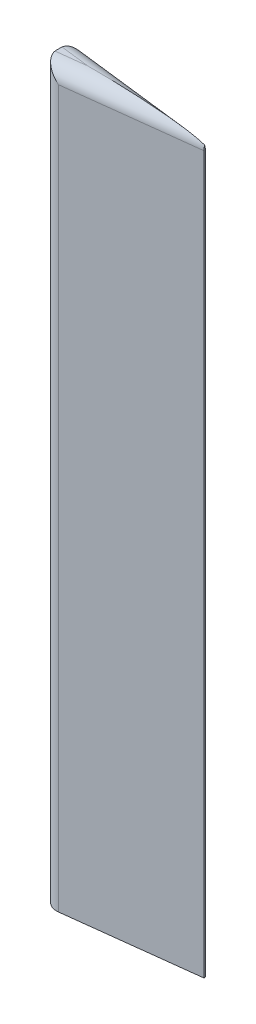
ISO-10303-21;
HEADER;
FILE_DESCRIPTION(('STEP AP214'),'2;1');
FILE_NAME('part.step','',(''),(''),'','','');
FILE_SCHEMA(('AUTOMOTIVE_DESIGN { 1 0 10303 214 1 1 1 1 }'));
ENDSEC;
DATA;
#1=APPLICATION_CONTEXT('core data for automotive mechanical design processes');
#2=APPLICATION_PROTOCOL_DEFINITION('international standard','automotive_design',2000,#1);
#3=PRODUCT_CONTEXT('',#1,'mechanical');
#4=PRODUCT('Part','Part','',(#3));
#5=PRODUCT_RELATED_PRODUCT_CATEGORY('part','',(#4));
#6=PRODUCT_DEFINITION_FORMATION('','',#4);
#7=PRODUCT_DEFINITION_CONTEXT('part definition',#1,'design');
#8=PRODUCT_DEFINITION('design','',#6,#7);
#9=PRODUCT_DEFINITION_SHAPE('','',#8);
#10=(LENGTH_UNIT() NAMED_UNIT(*) SI_UNIT(.MILLI.,.METRE.));
#11=(NAMED_UNIT(*) PLANE_ANGLE_UNIT() SI_UNIT($,.RADIAN.));
#12=(NAMED_UNIT(*) SI_UNIT($,.STERADIAN.) SOLID_ANGLE_UNIT());
#13=UNCERTAINTY_MEASURE_WITH_UNIT(LENGTH_MEASURE(1.E-05),#10,'distance_accuracy_value','');
#14=(GEOMETRIC_REPRESENTATION_CONTEXT(3) GLOBAL_UNCERTAINTY_ASSIGNED_CONTEXT((#13)) GLOBAL_UNIT_ASSIGNED_CONTEXT((#10,
#11,#12)) REPRESENTATION_CONTEXT('',''));
#15=CARTESIAN_POINT('',(0.,0.,0.));
#16=DIRECTION('',(0.,0.,1.));
#17=DIRECTION('',(1.,0.,0.));
#18=AXIS2_PLACEMENT_3D('',#15,#16,#17);
#19=CARTESIAN_POINT('',(20.,0.,5.));
#20=DIRECTION('',(0.,1.,0.));
#21=DIRECTION('',(-1.,0.,0.));
#22=AXIS2_PLACEMENT_3D('',#19,#20,#21);
#23=PLANE('',#22);
#24=DIRECTION('',(0.,0.,-1.));
#25=VECTOR('',#24,1.);
#26=CARTESIAN_POINT('',(0.,0.,5.));
#27=LINE('',#26,#25);
#28=CARTESIAN_POINT('',(0.,0.,2.74565147007773));
#29=VERTEX_POINT('',#28);
#30=CARTESIAN_POINT('',(0.,0.,2.25434852992227));
#31=VERTEX_POINT('',#30);
#32=EDGE_CURVE('E143',#29,#31,#27,.T.);
#33=ORIENTED_EDGE('',*,*,#32,.T.);
#34=CARTESIAN_POINT('',(2.,0.,2.25434852992227));
#35=DIRECTION('',(0.,1.,0.));
#36=DIRECTION('',(-1.,0.,0.));
#37=AXIS2_PLACEMENT_3D('',#34,#35,#36);
#38=CIRCLE('',#37,2.);
#39=CARTESIAN_POINT('',(2.23829044123685,0.,0.268594852948421));
#40=VERTEX_POINT('',#39);
#41=EDGE_CURVE('E119',#31,#40,#38,.F.);
#42=ORIENTED_EDGE('',*,*,#41,.T.);
#43=DIRECTION('',(0.992876838486922,0.,0.119145220618431));
#44=VECTOR('',#43,1.);
#45=CARTESIAN_POINT('',(20.307570977918,0.,2.43690851735016));
#46=LINE('',#45,#44);
#47=CARTESIAN_POINT('',(20.,0.,2.4));
#48=VERTEX_POINT('',#47);
#49=EDGE_CURVE('E113',#40,#48,#46,.T.);
#50=ORIENTED_EDGE('',*,*,#49,.T.);
#51=DIRECTION('',(0.,0.,-1.));
#52=VECTOR('',#51,1.);
#53=CARTESIAN_POINT('',(20.,0.,5.));
#54=LINE('',#53,#52);
#55=CARTESIAN_POINT('',(20.,0.,2.6));
#56=VERTEX_POINT('',#55);
#57=EDGE_CURVE('E118',#56,#48,#54,.T.);
#58=ORIENTED_EDGE('',*,*,#57,.F.);
#59=DIRECTION('',(-0.992876838486922,0.,0.119145220618431));
#60=VECTOR('',#59,1.);
#61=CARTESIAN_POINT('',(19.7160883280757,0.,2.63406940063091));
#62=LINE('',#61,#60);
#63=CARTESIAN_POINT('',(2.23829044123685,0.,4.73140514705158));
#64=VERTEX_POINT('',#63);
#65=EDGE_CURVE('E123',#56,#64,#62,.T.);
#66=ORIENTED_EDGE('',*,*,#65,.T.);
#67=CARTESIAN_POINT('',(2.,0.,2.74565147007773));
#68=DIRECTION('',(0.,1.,0.));
#69=DIRECTION('',(-1.,0.,0.));
#70=AXIS2_PLACEMENT_3D('',#67,#68,#69);
#71=CIRCLE('',#70,2.);
#72=EDGE_CURVE('E153',#64,#29,#71,.F.);
#73=ORIENTED_EDGE('',*,*,#72,.T.);
#74=EDGE_LOOP('',(#33,#42,#50,#58,#66,#73));
#75=FACE_BOUND('',#74,.T.);
#76=ADVANCED_FACE('F45',(#75),#23,.F.);
#77=CARTESIAN_POINT('',(20.,100.,5.));
#78=DIRECTION('',(-1.,0.,0.));
#79=DIRECTION('',(0.,0.,1.));
#80=AXIS2_PLACEMENT_3D('',#77,#78,#79);
#81=PLANE('',#80);
#82=DIRECTION('',(0.,1.,0.));
#83=VECTOR('',#82,1.);
#84=CARTESIAN_POINT('',(20.,-1.2E-05,2.4));
#85=LINE('',#84,#83);
#86=CARTESIAN_POINT('',(20.,98.,2.4));
#87=VERTEX_POINT('',#86);
#88=EDGE_CURVE('E124',#48,#87,#85,.T.);
#89=ORIENTED_EDGE('',*,*,#88,.T.);
#90=CARTESIAN_POINT('',(20.,98.,4.41434852992227));
#91=DIRECTION('',(-1.,0.,0.));
#92=DIRECTION('',(0.,0.,1.));
#93=AXIS2_PLACEMENT_3D('',#90,#91,#92);
#94=ELLIPSE('',#93,2.01434852992227,2.);
#95=CARTESIAN_POINT('',(20.,98.6223284432121,2.5));
#96=VERTEX_POINT('',#95);
#97=EDGE_CURVE('E11',#87,#96,#94,.F.);
#98=ORIENTED_EDGE('',*,*,#97,.T.);
#99=CARTESIAN_POINT('',(20.,98.,0.58565147007773));
#100=DIRECTION('',(-1.,0.,0.));
#101=DIRECTION('',(0.,0.,1.));
#102=AXIS2_PLACEMENT_3D('',#99,#100,#101);
#103=ELLIPSE('',#102,2.01434852992227,2.);
#104=CARTESIAN_POINT('',(20.,98.,2.6));
#105=VERTEX_POINT('',#104);
#106=EDGE_CURVE('E55',#96,#105,#103,.F.);
#107=ORIENTED_EDGE('',*,*,#106,.T.);
#108=DIRECTION('',(0.,1.,0.));
#109=VECTOR('',#108,1.);
#110=CARTESIAN_POINT('',(20.,-1.2E-05,2.6));
#111=LINE('',#110,#109);
#112=EDGE_CURVE('E130',#56,#105,#111,.T.);
#113=ORIENTED_EDGE('',*,*,#112,.F.);
#114=ORIENTED_EDGE('',*,*,#57,.T.);
#115=EDGE_LOOP('',(#89,#98,#107,#113,#114));
#116=FACE_BOUND('',#115,.T.);
#117=ADVANCED_FACE('F133',(#116),#81,.F.);
#118=CARTESIAN_POINT('',(0.,100.,5.));
#119=DIRECTION('',(0.,-1.,0.));
#120=DIRECTION('',(0.,0.,-1.));
#121=AXIS2_PLACEMENT_3D('',#118,#119,#120);
#122=PLANE('',#121);
#123=DIRECTION('',(0.992876838486922,0.,0.119145220618431));
#124=VECTOR('',#123,1.);
#125=CARTESIAN_POINT('',(0.35319220860541,100.,2.05673159495492));
#126=LINE('',#125,#124);
#127=CARTESIAN_POINT('',(4.0470955839811,100.,2.5));
#128=VERTEX_POINT('',#127);
#129=CARTESIAN_POINT('',(0.0142463230261558,100.,2.01605808868541));
#130=VERTEX_POINT('',#129);
#131=EDGE_CURVE('E181',#128,#130,#126,.F.);
#132=ORIENTED_EDGE('',*,*,#131,.T.);
#133=CARTESIAN_POINT('',(2.,100.,2.25434852992227));
#134=DIRECTION('',(0.,-1.,0.));
#135=DIRECTION('',(0.,0.,-1.));
#136=AXIS2_PLACEMENT_3D('',#133,#134,#135);
#137=CIRCLE('',#136,2.);
#138=CARTESIAN_POINT('',(0.,100.,2.25434852992227));
#139=VERTEX_POINT('',#138);
#140=EDGE_CURVE('E187',#130,#139,#137,.F.);
#141=ORIENTED_EDGE('',*,*,#140,.T.);
#142=DIRECTION('',(0.,0.,-1.));
#143=VECTOR('',#142,1.);
#144=CARTESIAN_POINT('',(0.,100.,5.));
#145=LINE('',#144,#143);
#146=CARTESIAN_POINT('',(0.,100.,2.74565147007773));
#147=VERTEX_POINT('',#146);
#148=EDGE_CURVE('E136',#147,#139,#145,.T.);
#149=ORIENTED_EDGE('',*,*,#148,.F.);
#150=CARTESIAN_POINT('',(2.,100.,2.74565147007773));
#151=DIRECTION('',(0.,-1.,0.));
#152=DIRECTION('',(0.,0.,-1.));
#153=AXIS2_PLACEMENT_3D('',#150,#151,#152);
#154=CIRCLE('',#153,2.);
#155=CARTESIAN_POINT('',(0.014246323026156,100.,2.98394191131459));
#156=VERTEX_POINT('',#155);
#157=EDGE_CURVE('E184',#147,#156,#154,.F.);
#158=ORIENTED_EDGE('',*,*,#157,.T.);
#159=DIRECTION('',(-0.992876838486922,0.,0.119145220618431));
#160=VECTOR('',#159,1.);
#161=CARTESIAN_POINT('',(-0.238290441236861,100.,3.01424632302616));
#162=LINE('',#161,#160);
#163=EDGE_CURVE('E178',#156,#128,#162,.F.);
#164=ORIENTED_EDGE('',*,*,#163,.T.);
#165=EDGE_LOOP('',(#132,#141,#149,#158,#164));
#166=FACE_BOUND('',#165,.T.);
#167=ADVANCED_FACE('F215',(#166),#122,.F.);
#168=CARTESIAN_POINT('',(0.,0.,5.));
#169=DIRECTION('',(1.,0.,0.));
#170=DIRECTION('',(0.,0.,-1.));
#171=AXIS2_PLACEMENT_3D('',#168,#169,#170);
#172=PLANE('',#171);
#173=ORIENTED_EDGE('',*,*,#148,.T.);
#174=DIRECTION('',(0.,-1.,0.));
#175=VECTOR('',#174,1.);
#176=CARTESIAN_POINT('',(0.,0.,2.25434852992227));
#177=LINE('',#176,#175);
#178=EDGE_CURVE('E140',#139,#31,#177,.T.);
#179=ORIENTED_EDGE('',*,*,#178,.T.);
#180=ORIENTED_EDGE('',*,*,#32,.F.);
#181=DIRECTION('',(0.,-1.,0.));
#182=VECTOR('',#181,1.);
#183=CARTESIAN_POINT('',(0.,0.,2.74565147007773));
#184=LINE('',#183,#182);
#185=EDGE_CURVE('E135',#29,#147,#184,.F.);
#186=ORIENTED_EDGE('',*,*,#185,.T.);
#187=EDGE_LOOP('',(#173,#179,#180,#186));
#188=FACE_BOUND('',#187,.T.);
#189=ADVANCED_FACE('F219',(#188),#172,.F.);
#190=CARTESIAN_POINT('',(0.,-1.2E-05,0.));
#191=DIRECTION('',(-0.119145220618431,0.,0.992876838486922));
#192=DIRECTION('',(0.992876838486922,0.,0.119145220618431));
#193=AXIS2_PLACEMENT_3D('',#190,#191,#192);
#194=PLANE('',#193);
#195=ORIENTED_EDGE('',*,*,#49,.F.);
#196=DIRECTION('',(0.,-1.,0.));
#197=VECTOR('',#196,1.);
#198=CARTESIAN_POINT('',(2.23829044123686,-1.2E-05,0.268594852948423));
#199=LINE('',#198,#197);
#200=CARTESIAN_POINT('',(2.23829044123686,98.,0.268594852948423));
#201=VERTEX_POINT('',#200);
#202=EDGE_CURVE('E173',#40,#201,#199,.F.);
#203=ORIENTED_EDGE('',*,*,#202,.T.);
#204=DIRECTION('',(0.992876838486922,0.,0.119145220618431));
#205=VECTOR('',#204,1.);
#206=CARTESIAN_POINT('',(0.,98.,0.));
#207=LINE('',#206,#205);
#208=EDGE_CURVE('E128',#201,#87,#207,.T.);
#209=ORIENTED_EDGE('',*,*,#208,.T.);
#210=ORIENTED_EDGE('',*,*,#88,.F.);
#211=EDGE_LOOP('',(#195,#203,#209,#210));
#212=FACE_BOUND('',#211,.T.);
#213=ADVANCED_FACE('F126',(#212),#194,.F.);
#214=CARTESIAN_POINT('',(0.,-1.2E-05,5.));
#215=DIRECTION('',(-0.119145220618431,0.,-0.992876838486922));
#216=DIRECTION('',(-0.992876838486922,0.,0.119145220618431));
#217=AXIS2_PLACEMENT_3D('',#214,#215,#216);
#218=PLANE('',#217);
#219=DIRECTION('',(-0.992876838486922,0.,0.119145220618431));
#220=VECTOR('',#219,1.);
#221=CARTESIAN_POINT('',(0.,98.,5.));
#222=LINE('',#221,#220);
#223=CARTESIAN_POINT('',(2.23829044123686,98.,4.73140514705158));
#224=VERTEX_POINT('',#223);
#225=EDGE_CURVE('E69',#105,#224,#222,.T.);
#226=ORIENTED_EDGE('',*,*,#225,.T.);
#227=DIRECTION('',(0.,-1.,0.));
#228=VECTOR('',#227,1.);
#229=CARTESIAN_POINT('',(2.23829044123686,-1.2E-05,4.73140514705158));
#230=LINE('',#229,#228);
#231=EDGE_CURVE('E167',#224,#64,#230,.T.);
#232=ORIENTED_EDGE('',*,*,#231,.T.);
#233=ORIENTED_EDGE('',*,*,#65,.F.);
#234=ORIENTED_EDGE('',*,*,#112,.T.);
#235=EDGE_LOOP('',(#226,#232,#233,#234));
#236=FACE_BOUND('',#235,.T.);
#237=ADVANCED_FACE('F209',(#236),#218,.F.);
#238=CARTESIAN_POINT('',(2.,-1.2E-05,2.74565147007773));
#239=DIRECTION('',(0.,-1.,0.));
#240=DIRECTION('',(0.,0.,-1.));
#241=AXIS2_PLACEMENT_3D('',#238,#239,#240);
#242=CYLINDRICAL_SURFACE('',#241,2.);
#243=ORIENTED_EDGE('',*,*,#72,.F.);
#244=ORIENTED_EDGE('',*,*,#231,.F.);
#245=CARTESIAN_POINT('',(2.,98.,2.74565147007773));
#246=DIRECTION('',(-0.702069945377163,-0.707106781186547,0.0842483934452597));
#247=DIRECTION('',(-0.702069945377163,0.707106781186547,0.0842483934452597));
#248=AXIS2_PLACEMENT_3D('',#245,#246,#247);
#249=ELLIPSE('',#248,2.82842712474619,2.);
#250=EDGE_CURVE('E49',#156,#224,#249,.F.);
#251=ORIENTED_EDGE('',*,*,#250,.F.);
#252=ORIENTED_EDGE('',*,*,#157,.F.);
#253=ORIENTED_EDGE('',*,*,#185,.F.);
#254=EDGE_LOOP('',(#243,#244,#251,#252,#253));
#255=FACE_BOUND('',#254,.T.);
#256=ADVANCED_FACE('F47',(#255),#242,.T.);
#257=CARTESIAN_POINT('',(-0.238290441236862,98.,3.01424632302616));
#258=DIRECTION('',(-0.992876838486922,0.,0.119145220618431));
#259=DIRECTION('',(0.119145220618431,0.,0.992876838486922));
#260=AXIS2_PLACEMENT_3D('',#257,#258,#259);
#261=CYLINDRICAL_SURFACE('',#260,2.);
#262=ORIENTED_EDGE('',*,*,#225,.F.);
#263=ORIENTED_EDGE('',*,*,#106,.F.);
#264=CARTESIAN_POINT('',(4.0470955839811,98.,2.5));
#265=DIRECTION('',(0.,0.,1.));
#266=DIRECTION('',(1.,0.,0.));
#267=AXIS2_PLACEMENT_3D('',#264,#265,#266);
#268=ELLIPSE('',#267,16.7862377493523,2.);
#269=EDGE_CURVE('E199',#128,#96,#268,.F.);
#270=ORIENTED_EDGE('',*,*,#269,.F.);
#271=ORIENTED_EDGE('',*,*,#163,.F.);
#272=ORIENTED_EDGE('',*,*,#250,.T.);
#273=EDGE_LOOP('',(#262,#263,#270,#271,#272));
#274=FACE_BOUND('',#273,.T.);
#275=ADVANCED_FACE('F210',(#274),#261,.T.);
#276=CARTESIAN_POINT('',(-0.238290441236861,98.,1.98575367697384));
#277=DIRECTION('',(0.992876838486922,0.,0.119145220618431));
#278=DIRECTION('',(0.119145220618431,0.,-0.992876838486922));
#279=AXIS2_PLACEMENT_3D('',#276,#277,#278);
#280=CYLINDRICAL_SURFACE('',#279,2.);
#281=ORIENTED_EDGE('',*,*,#97,.F.);
#282=ORIENTED_EDGE('',*,*,#208,.F.);
#283=CARTESIAN_POINT('',(2.,98.,2.25434852992227));
#284=DIRECTION('',(0.702069945377163,0.707106781186547,0.0842483934452595));
#285=DIRECTION('',(0.702069945377163,-0.707106781186547,0.0842483934452595));
#286=AXIS2_PLACEMENT_3D('',#283,#284,#285);
#287=ELLIPSE('',#286,2.82842712474619,2.);
#288=EDGE_CURVE('E196',#130,#201,#287,.F.);
#289=ORIENTED_EDGE('',*,*,#288,.F.);
#290=ORIENTED_EDGE('',*,*,#131,.F.);
#291=ORIENTED_EDGE('',*,*,#269,.T.);
#292=EDGE_LOOP('',(#281,#282,#289,#290,#291));
#293=FACE_BOUND('',#292,.T.);
#294=ADVANCED_FACE('F212',(#293),#280,.T.);
#295=CARTESIAN_POINT('',(2.,0.,2.25434852992227));
#296=DIRECTION('',(0.,-1.,0.));
#297=DIRECTION('',(0.,0.,-1.));
#298=AXIS2_PLACEMENT_3D('',#295,#296,#297);
#299=CYLINDRICAL_SURFACE('',#298,2.);
#300=ORIENTED_EDGE('',*,*,#288,.T.);
#301=ORIENTED_EDGE('',*,*,#202,.F.);
#302=ORIENTED_EDGE('',*,*,#41,.F.);
#303=ORIENTED_EDGE('',*,*,#178,.F.);
#304=ORIENTED_EDGE('',*,*,#140,.F.);
#305=EDGE_LOOP('',(#300,#301,#302,#303,#304));
#306=FACE_BOUND('',#305,.T.);
#307=ADVANCED_FACE('F221',(#306),#299,.T.);
#308=CLOSED_SHELL('',(#76,#117,#167,#189,#213,#237,#256,#275,#294,#307));
#309=MANIFOLD_SOLID_BREP('B2',#308);
#310=ADVANCED_BREP_SHAPE_REPRESENTATION('',(#18,#309),#14);
#311=SHAPE_DEFINITION_REPRESENTATION(#9,#310);
ENDSEC;
END-ISO-10303-21;
